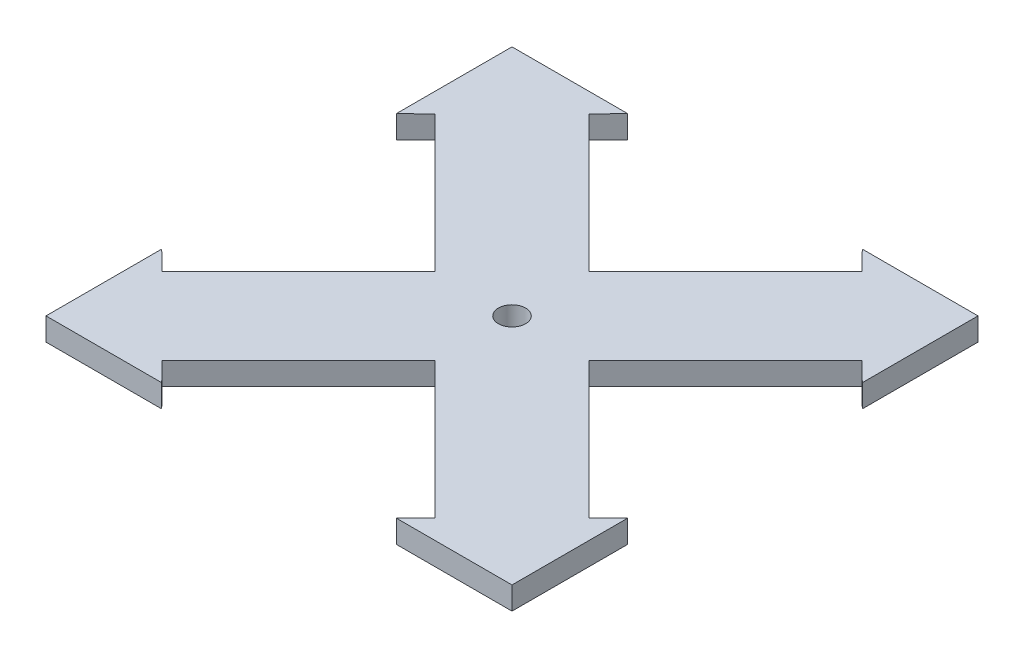
ISO-10303-21;
HEADER;
FILE_DESCRIPTION(('STEP AP214'),'2;1');
FILE_NAME('part.step','',(''),(''),'','','');
FILE_SCHEMA(('AUTOMOTIVE_DESIGN { 1 0 10303 214 1 1 1 1 }'));
ENDSEC;
DATA;
#1=APPLICATION_CONTEXT('core data for automotive mechanical design processes');
#2=APPLICATION_PROTOCOL_DEFINITION('international standard','automotive_design',2000,#1);
#3=PRODUCT_CONTEXT('',#1,'mechanical');
#4=PRODUCT('Part','Part','',(#3));
#5=PRODUCT_RELATED_PRODUCT_CATEGORY('part','',(#4));
#6=PRODUCT_DEFINITION_FORMATION('','',#4);
#7=PRODUCT_DEFINITION_CONTEXT('part definition',#1,'design');
#8=PRODUCT_DEFINITION('design','',#6,#7);
#9=PRODUCT_DEFINITION_SHAPE('','',#8);
#10=(LENGTH_UNIT() NAMED_UNIT(*) SI_UNIT(.MILLI.,.METRE.));
#11=(NAMED_UNIT(*) PLANE_ANGLE_UNIT() SI_UNIT($,.RADIAN.));
#12=(NAMED_UNIT(*) SI_UNIT($,.STERADIAN.) SOLID_ANGLE_UNIT());
#13=UNCERTAINTY_MEASURE_WITH_UNIT(LENGTH_MEASURE(1.E-05),#10,'distance_accuracy_value','');
#14=(GEOMETRIC_REPRESENTATION_CONTEXT(3) GLOBAL_UNCERTAINTY_ASSIGNED_CONTEXT((#13)) GLOBAL_UNIT_ASSIGNED_CONTEXT((#10,
#11,#12)) REPRESENTATION_CONTEXT('',''));
#15=CARTESIAN_POINT('',(0.,0.,0.));
#16=DIRECTION('',(0.,0.,1.));
#17=DIRECTION('',(1.,0.,0.));
#18=AXIS2_PLACEMENT_3D('',#15,#16,#17);
#19=CARTESIAN_POINT('',(0.,2.5,0.));
#20=DIRECTION('',(0.,-1.,0.));
#21=DIRECTION('',(0.,0.,-1.));
#22=AXIS2_PLACEMENT_3D('',#19,#20,#21);
#23=PLANE('',#22);
#24=DIRECTION('',(-0.707106781186783,0.,0.707106781186312));
#25=VECTOR('',#24,1.);
#26=CARTESIAN_POINT('',(-3.75314219151656E-12,2.5,-8.48528137424492));
#27=LINE('',#26,#25);
#28=CARTESIAN_POINT('',(15.,2.5,-23.4852813742387));
#29=VERTEX_POINT('',#28);
#30=CARTESIAN_POINT('',(-3.75314219151656E-12,2.5,-8.48528137424492));
#31=VERTEX_POINT('',#30);
#32=EDGE_CURVE('E273',#29,#31,#27,.T.);
#33=ORIENTED_EDGE('',*,*,#32,.T.);
#34=DIRECTION('',(-0.707106781186477,0.,-0.707106781186618));
#35=VECTOR('',#34,1.);
#36=CARTESIAN_POINT('',(-15.0000000000079,2.5,-23.485281374252));
#37=LINE('',#36,#35);
#38=CARTESIAN_POINT('',(-15.0000000000079,2.5,-23.485281374252));
#39=VERTEX_POINT('',#38);
#40=EDGE_CURVE('E141',#31,#39,#37,.T.);
#41=ORIENTED_EDGE('',*,*,#40,.T.);
#42=DIRECTION('',(0.699281678944915,0.,-0.714846230662218));
#43=VECTOR('',#42,1.);
#44=CARTESIAN_POINT('',(-15.0000000000079,2.5,-23.485281374252));
#45=LINE('',#44,#43);
#46=CARTESIAN_POINT('',(-12.9021549631807,2.5,-25.6298200662309));
#47=VERTEX_POINT('',#46);
#48=EDGE_CURVE('E336',#39,#47,#45,.T.);
#49=ORIENTED_EDGE('',*,*,#48,.T.);
#50=DIRECTION('',(-1.,0.,0.));
#51=VECTOR('',#50,1.);
#52=CARTESIAN_POINT('',(-25.6298200662306,2.5,-25.6298200662309));
#53=LINE('',#52,#51);
#54=CARTESIAN_POINT('',(-25.6298200662306,2.5,-25.6298200662309));
#55=VERTEX_POINT('',#54);
#56=EDGE_CURVE('E355',#47,#55,#53,.T.);
#57=ORIENTED_EDGE('',*,*,#56,.T.);
#58=DIRECTION('',(0.,0.,1.));
#59=VECTOR('',#58,1.);
#60=CARTESIAN_POINT('',(-25.6298200662306,2.5,-12.902154963181));
#61=LINE('',#60,#59);
#62=CARTESIAN_POINT('',(-25.6298200662306,2.5,-12.902154963181));
#63=VERTEX_POINT('',#62);
#64=EDGE_CURVE('E352',#55,#63,#61,.T.);
#65=ORIENTED_EDGE('',*,*,#64,.T.);
#66=DIRECTION('',(0.714846230665675,0.,-0.69928167894138));
#67=VECTOR('',#66,1.);
#68=CARTESIAN_POINT('',(-23.4852813742387,2.5,-15.0000000000002));
#69=LINE('',#68,#67);
#70=CARTESIAN_POINT('',(-23.4852813742387,2.5,-15.0000000000002));
#71=VERTEX_POINT('',#70);
#72=EDGE_CURVE('E354',#63,#71,#69,.T.);
#73=ORIENTED_EDGE('',*,*,#72,.T.);
#74=DIRECTION('',(0.707106781186644,0.,0.707106781186451));
#75=VECTOR('',#74,1.);
#76=CARTESIAN_POINT('',(-23.4852813742387,2.5,-15.0000000000002));
#77=LINE('',#76,#75);
#78=CARTESIAN_POINT('',(-8.48528137424864,2.5,-1.4210854715202E-11));
#79=VERTEX_POINT('',#78);
#80=EDGE_CURVE('E357',#71,#79,#77,.T.);
#81=ORIENTED_EDGE('',*,*,#80,.T.);
#82=DIRECTION('',(-0.707106781185841,0.,0.707106781187254));
#83=VECTOR('',#82,1.);
#84=CARTESIAN_POINT('',(-23.4852813742339,2.5,15.0000000000011));
#85=LINE('',#84,#83);
#86=CARTESIAN_POINT('',(-23.4852813742339,2.5,15.0000000000011));
#87=VERTEX_POINT('',#86);
#88=EDGE_CURVE('E363',#79,#87,#85,.T.);
#89=ORIENTED_EDGE('',*,*,#88,.T.);
#90=DIRECTION('',(-0.714846230666275,0.,-0.699281678940768));
#91=VECTOR('',#90,1.);
#92=CARTESIAN_POINT('',(-23.4852813742339,2.5,15.0000000000011));
#93=LINE('',#92,#91);
#94=CARTESIAN_POINT('',(-25.6298200662309,2.5,12.9021549631805));
#95=VERTEX_POINT('',#94);
#96=EDGE_CURVE('E365',#87,#95,#93,.T.);
#97=ORIENTED_EDGE('',*,*,#96,.T.);
#98=DIRECTION('',(0.,0.,1.));
#99=VECTOR('',#98,1.);
#100=CARTESIAN_POINT('',(-25.6298200662309,2.5,25.6298200662305));
#101=LINE('',#100,#99);
#102=CARTESIAN_POINT('',(-25.6298200662309,2.5,25.6298200662305));
#103=VERTEX_POINT('',#102);
#104=EDGE_CURVE('E367',#95,#103,#101,.T.);
#105=ORIENTED_EDGE('',*,*,#104,.T.);
#106=DIRECTION('',(1.,0.,0.));
#107=VECTOR('',#106,1.);
#108=CARTESIAN_POINT('',(-12.902154963181,2.5,25.6298200662305));
#109=LINE('',#108,#107);
#110=CARTESIAN_POINT('',(-12.902154963181,2.5,25.6298200662305));
#111=VERTEX_POINT('',#110);
#112=EDGE_CURVE('E369',#103,#111,#109,.T.);
#113=ORIENTED_EDGE('',*,*,#112,.T.);
#114=DIRECTION('',(-0.699281678883351,0.,-0.714846230722441));
#115=VECTOR('',#114,1.);
#116=CARTESIAN_POINT('',(-14.9999999999997,2.5,23.4852813738907));
#117=LINE('',#116,#115);
#118=CARTESIAN_POINT('',(-14.9999999999997,2.5,23.4852813738907));
#119=VERTEX_POINT('',#118);
#120=EDGE_CURVE('E371',#111,#119,#117,.T.);
#121=ORIENTED_EDGE('',*,*,#120,.T.);
#122=DIRECTION('',(0.707106781186939,0.,-0.707106781186156));
#123=VECTOR('',#122,1.);
#124=CARTESIAN_POINT('',(-14.9999999999997,2.5,23.4852813738907));
#125=LINE('',#124,#123);
#126=CARTESIAN_POINT('',(1.47254850175037E-11,2.5,8.48528137389289));
#127=VERTEX_POINT('',#126);
#128=EDGE_CURVE('E373',#119,#127,#125,.T.);
#129=ORIENTED_EDGE('',*,*,#128,.T.);
#130=DIRECTION('',(0.707106781187716,0.,0.707106781185379));
#131=VECTOR('',#130,1.);
#132=CARTESIAN_POINT('',(1.47254850175037E-11,2.5,8.48528137389289));
#133=LINE('',#132,#131);
#134=CARTESIAN_POINT('',(14.9999999999918,2.5,23.4852813738204));
#135=VERTEX_POINT('',#134);
#136=EDGE_CURVE('E375',#127,#135,#133,.T.);
#137=ORIENTED_EDGE('',*,*,#136,.T.);
#138=DIRECTION('',(-0.699281678870311,0.,0.714846230735197));
#139=VECTOR('',#138,1.);
#140=CARTESIAN_POINT('',(14.9999999999918,2.5,23.4852813738204));
#141=LINE('',#140,#139);
#142=CARTESIAN_POINT('',(12.9021549631805,2.5,25.6298200662307));
#143=VERTEX_POINT('',#142);
#144=EDGE_CURVE('E377',#135,#143,#141,.T.);
#145=ORIENTED_EDGE('',*,*,#144,.T.);
#146=DIRECTION('',(1.,0.,0.));
#147=VECTOR('',#146,1.);
#148=CARTESIAN_POINT('',(25.6298200662305,2.5,25.6298200662307));
#149=LINE('',#148,#147);
#150=CARTESIAN_POINT('',(25.6298200662305,2.5,25.6298200662307));
#151=VERTEX_POINT('',#150);
#152=EDGE_CURVE('E379',#143,#151,#149,.T.);
#153=ORIENTED_EDGE('',*,*,#152,.T.);
#154=DIRECTION('',(0.,0.,-1.));
#155=VECTOR('',#154,1.);
#156=CARTESIAN_POINT('',(25.6298200662304,2.5,12.9021549631808));
#157=LINE('',#156,#155);
#158=CARTESIAN_POINT('',(25.6298200662304,2.5,12.9021549631808));
#159=VERTEX_POINT('',#158);
#160=EDGE_CURVE('E381',#151,#159,#157,.T.);
#161=ORIENTED_EDGE('',*,*,#160,.T.);
#162=DIRECTION('',(-0.714846230665678,0.,0.699281678941378));
#163=VECTOR('',#162,1.);
#164=CARTESIAN_POINT('',(23.4852813742385,2.5,15.));
#165=LINE('',#164,#163);
#166=CARTESIAN_POINT('',(23.4852813742385,2.5,15.));
#167=VERTEX_POINT('',#166);
#168=EDGE_CURVE('E383',#159,#167,#165,.T.);
#169=ORIENTED_EDGE('',*,*,#168,.T.);
#170=DIRECTION('',(-0.707106781184294,0.,-0.707106781188801));
#171=VECTOR('',#170,1.);
#172=CARTESIAN_POINT('',(8.48528137434823,2.5,1.41048197427329E-11));
#173=LINE('',#172,#171);
#174=CARTESIAN_POINT('',(8.48528137434823,2.5,1.41048197427329E-11));
#175=VERTEX_POINT('',#174);
#176=EDGE_CURVE('E385',#167,#175,#173,.T.);
#177=ORIENTED_EDGE('',*,*,#176,.T.);
#178=DIRECTION('',(0.707106781182032,0.,-0.707106781191063));
#179=VECTOR('',#178,1.);
#180=CARTESIAN_POINT('',(8.48528137434823,2.5,1.41048197427329E-11));
#181=LINE('',#180,#179);
#182=CARTESIAN_POINT('',(23.4852813741639,2.5,-14.9999999999932));
#183=VERTEX_POINT('',#182);
#184=EDGE_CURVE('E387',#175,#183,#181,.T.);
#185=ORIENTED_EDGE('',*,*,#184,.T.);
#186=DIRECTION('',(0.714846230678996,0.,0.699281678927764));
#187=VECTOR('',#186,1.);
#188=CARTESIAN_POINT('',(23.4852813741639,2.5,-14.9999999999932));
#189=LINE('',#188,#187);
#190=CARTESIAN_POINT('',(25.6298200662307,2.5,-12.9021549631807));
#191=VERTEX_POINT('',#190);
#192=EDGE_CURVE('E208',#183,#191,#189,.T.);
#193=ORIENTED_EDGE('',*,*,#192,.T.);
#194=DIRECTION('',(0.,0.,-1.));
#195=VECTOR('',#194,1.);
#196=CARTESIAN_POINT('',(25.6298200662307,2.5,-25.6298200662306));
#197=LINE('',#196,#195);
#198=CARTESIAN_POINT('',(25.6298200662307,2.5,-25.6298200662306));
#199=VERTEX_POINT('',#198);
#200=EDGE_CURVE('E202',#191,#199,#197,.T.);
#201=ORIENTED_EDGE('',*,*,#200,.T.);
#202=DIRECTION('',(-1.,0.,0.));
#203=VECTOR('',#202,1.);
#204=CARTESIAN_POINT('',(12.9021549631808,2.5,-25.6298200662306));
#205=LINE('',#204,#203);
#206=CARTESIAN_POINT('',(12.9021549631808,2.5,-25.6298200662306));
#207=VERTEX_POINT('',#206);
#208=EDGE_CURVE('E206',#199,#207,#205,.T.);
#209=ORIENTED_EDGE('',*,*,#208,.T.);
#210=DIRECTION('',(0.699281678941379,0.,0.714846230665677));
#211=VECTOR('',#210,1.);
#212=CARTESIAN_POINT('',(15.,2.5,-23.4852813742387));
#213=LINE('',#212,#211);
#214=EDGE_CURVE('E50',#207,#29,#213,.T.);
#215=ORIENTED_EDGE('',*,*,#214,.T.);
#216=EDGE_LOOP('',(#33,#41,#49,#57,#65,#73,#81,#89,#97,#105,#113,#121,#129,#137,#145,#153,#161,
#169,#177,#185,#193,#201,#209,#215));
#217=FACE_BOUND('',#216,.T.);
#218=CARTESIAN_POINT('',(0.,2.5,0.));
#219=DIRECTION('',(0.,1.,0.));
#220=DIRECTION('',(0.,0.,1.));
#221=AXIS2_PLACEMENT_3D('',#218,#219,#220);
#222=CIRCLE('',#221,1.5);
#223=CARTESIAN_POINT('',(0.,2.5,1.5));
#224=VERTEX_POINT('',#223);
#225=EDGE_CURVE('E230',#224,#224,#222,.T.);
#226=ORIENTED_EDGE('',*,*,#225,.F.);
#227=EDGE_LOOP('',(#226));
#228=FACE_BOUND('',#227,.T.);
#229=ADVANCED_FACE('F33',(#217,#228),#23,.F.);
#230=CARTESIAN_POINT('',(0.,0.,0.));
#231=DIRECTION('',(0.,-1.,0.));
#232=DIRECTION('',(0.,0.,-1.));
#233=AXIS2_PLACEMENT_3D('',#230,#231,#232);
#234=PLANE('',#233);
#235=DIRECTION('',(-0.707106781186783,0.,0.707106781186312));
#236=VECTOR('',#235,1.);
#237=CARTESIAN_POINT('',(-3.75314219151656E-12,0.,-8.48528137424492));
#238=LINE('',#237,#236);
#239=CARTESIAN_POINT('',(15.,0.,-23.4852813742387));
#240=VERTEX_POINT('',#239);
#241=CARTESIAN_POINT('',(-3.75314219151656E-12,0.,-8.48528137424492));
#242=VERTEX_POINT('',#241);
#243=EDGE_CURVE('E226',#240,#242,#238,.T.);
#244=ORIENTED_EDGE('',*,*,#243,.F.);
#245=DIRECTION('',(0.699281678941379,0.,0.714846230665677));
#246=VECTOR('',#245,1.);
#247=CARTESIAN_POINT('',(15.,0.,-23.4852813742387));
#248=LINE('',#247,#246);
#249=CARTESIAN_POINT('',(12.9021549631808,0.,-25.6298200662306));
#250=VERTEX_POINT('',#249);
#251=EDGE_CURVE('E133',#250,#240,#248,.T.);
#252=ORIENTED_EDGE('',*,*,#251,.F.);
#253=DIRECTION('',(-1.,0.,0.));
#254=VECTOR('',#253,1.);
#255=CARTESIAN_POINT('',(12.9021549631808,0.,-25.6298200662306));
#256=LINE('',#255,#254);
#257=CARTESIAN_POINT('',(25.6298200662307,0.,-25.6298200662306));
#258=VERTEX_POINT('',#257);
#259=EDGE_CURVE('E127',#258,#250,#256,.T.);
#260=ORIENTED_EDGE('',*,*,#259,.F.);
#261=DIRECTION('',(0.,0.,-1.));
#262=VECTOR('',#261,1.);
#263=CARTESIAN_POINT('',(25.6298200662307,0.,-25.6298200662306));
#264=LINE('',#263,#262);
#265=CARTESIAN_POINT('',(25.6298200662307,0.,-12.9021549631807));
#266=VERTEX_POINT('',#265);
#267=EDGE_CURVE('E216',#266,#258,#264,.T.);
#268=ORIENTED_EDGE('',*,*,#267,.F.);
#269=DIRECTION('',(0.714846230678996,0.,0.699281678927764));
#270=VECTOR('',#269,1.);
#271=CARTESIAN_POINT('',(23.4852813741639,0.,-14.9999999999932));
#272=LINE('',#271,#270);
#273=CARTESIAN_POINT('',(23.4852813741639,0.,-14.9999999999932));
#274=VERTEX_POINT('',#273);
#275=EDGE_CURVE('E268',#274,#266,#272,.T.);
#276=ORIENTED_EDGE('',*,*,#275,.F.);
#277=DIRECTION('',(0.707106781182032,0.,-0.707106781191063));
#278=VECTOR('',#277,1.);
#279=CARTESIAN_POINT('',(8.48528137434823,0.,1.41048197427329E-11));
#280=LINE('',#279,#278);
#281=CARTESIAN_POINT('',(8.48528137434823,0.,1.41048197427329E-11));
#282=VERTEX_POINT('',#281);
#283=EDGE_CURVE('E266',#282,#274,#280,.T.);
#284=ORIENTED_EDGE('',*,*,#283,.F.);
#285=DIRECTION('',(-0.707106781184294,0.,-0.707106781188801));
#286=VECTOR('',#285,1.);
#287=CARTESIAN_POINT('',(8.48528137434823,0.,1.41048197427329E-11));
#288=LINE('',#287,#286);
#289=CARTESIAN_POINT('',(23.4852813742385,0.,15.));
#290=VERTEX_POINT('',#289);
#291=EDGE_CURVE('E264',#290,#282,#288,.T.);
#292=ORIENTED_EDGE('',*,*,#291,.F.);
#293=DIRECTION('',(-0.714846230665678,0.,0.699281678941378));
#294=VECTOR('',#293,1.);
#295=CARTESIAN_POINT('',(23.4852813742385,0.,15.));
#296=LINE('',#295,#294);
#297=CARTESIAN_POINT('',(25.6298200662304,0.,12.9021549631808));
#298=VERTEX_POINT('',#297);
#299=EDGE_CURVE('E262',#298,#290,#296,.T.);
#300=ORIENTED_EDGE('',*,*,#299,.F.);
#301=DIRECTION('',(0.,0.,-1.));
#302=VECTOR('',#301,1.);
#303=CARTESIAN_POINT('',(25.6298200662304,0.,12.9021549631808));
#304=LINE('',#303,#302);
#305=CARTESIAN_POINT('',(25.6298200662305,0.,25.6298200662307));
#306=VERTEX_POINT('',#305);
#307=EDGE_CURVE('E260',#306,#298,#304,.T.);
#308=ORIENTED_EDGE('',*,*,#307,.F.);
#309=DIRECTION('',(1.,0.,0.));
#310=VECTOR('',#309,1.);
#311=CARTESIAN_POINT('',(25.6298200662305,0.,25.6298200662307));
#312=LINE('',#311,#310);
#313=CARTESIAN_POINT('',(12.9021549631805,0.,25.6298200662307));
#314=VERTEX_POINT('',#313);
#315=EDGE_CURVE('E258',#314,#306,#312,.T.);
#316=ORIENTED_EDGE('',*,*,#315,.F.);
#317=DIRECTION('',(-0.699281678870311,0.,0.714846230735197));
#318=VECTOR('',#317,1.);
#319=CARTESIAN_POINT('',(14.9999999999918,0.,23.4852813738204));
#320=LINE('',#319,#318);
#321=CARTESIAN_POINT('',(14.9999999999918,0.,23.4852813738204));
#322=VERTEX_POINT('',#321);
#323=EDGE_CURVE('E256',#322,#314,#320,.T.);
#324=ORIENTED_EDGE('',*,*,#323,.F.);
#325=DIRECTION('',(0.707106781187716,0.,0.707106781185379));
#326=VECTOR('',#325,1.);
#327=CARTESIAN_POINT('',(1.47254850175037E-11,0.,8.48528137389289));
#328=LINE('',#327,#326);
#329=CARTESIAN_POINT('',(1.47254850175037E-11,0.,8.48528137389289));
#330=VERTEX_POINT('',#329);
#331=EDGE_CURVE('E254',#330,#322,#328,.T.);
#332=ORIENTED_EDGE('',*,*,#331,.F.);
#333=DIRECTION('',(0.707106781186939,0.,-0.707106781186156));
#334=VECTOR('',#333,1.);
#335=CARTESIAN_POINT('',(-14.9999999999997,0.,23.4852813738907));
#336=LINE('',#335,#334);
#337=CARTESIAN_POINT('',(-14.9999999999997,0.,23.4852813738907));
#338=VERTEX_POINT('',#337);
#339=EDGE_CURVE('E252',#338,#330,#336,.T.);
#340=ORIENTED_EDGE('',*,*,#339,.F.);
#341=DIRECTION('',(-0.699281678883351,0.,-0.714846230722441));
#342=VECTOR('',#341,1.);
#343=CARTESIAN_POINT('',(-14.9999999999997,0.,23.4852813738907));
#344=LINE('',#343,#342);
#345=CARTESIAN_POINT('',(-12.902154963181,0.,25.6298200662305));
#346=VERTEX_POINT('',#345);
#347=EDGE_CURVE('E250',#346,#338,#344,.T.);
#348=ORIENTED_EDGE('',*,*,#347,.F.);
#349=DIRECTION('',(1.,0.,0.));
#350=VECTOR('',#349,1.);
#351=CARTESIAN_POINT('',(-12.902154963181,0.,25.6298200662305));
#352=LINE('',#351,#350);
#353=CARTESIAN_POINT('',(-25.6298200662309,0.,25.6298200662305));
#354=VERTEX_POINT('',#353);
#355=EDGE_CURVE('E248',#354,#346,#352,.T.);
#356=ORIENTED_EDGE('',*,*,#355,.F.);
#357=DIRECTION('',(0.,0.,1.));
#358=VECTOR('',#357,1.);
#359=CARTESIAN_POINT('',(-25.6298200662309,0.,25.6298200662305));
#360=LINE('',#359,#358);
#361=CARTESIAN_POINT('',(-25.6298200662309,0.,12.9021549631805));
#362=VERTEX_POINT('',#361);
#363=EDGE_CURVE('E246',#362,#354,#360,.T.);
#364=ORIENTED_EDGE('',*,*,#363,.F.);
#365=DIRECTION('',(-0.714846230666275,0.,-0.699281678940768));
#366=VECTOR('',#365,1.);
#367=CARTESIAN_POINT('',(-23.4852813742339,0.,15.0000000000011));
#368=LINE('',#367,#366);
#369=CARTESIAN_POINT('',(-23.4852813742339,0.,15.0000000000011));
#370=VERTEX_POINT('',#369);
#371=EDGE_CURVE('E244',#370,#362,#368,.T.);
#372=ORIENTED_EDGE('',*,*,#371,.F.);
#373=DIRECTION('',(-0.707106781185841,0.,0.707106781187254));
#374=VECTOR('',#373,1.);
#375=CARTESIAN_POINT('',(-23.4852813742339,0.,15.0000000000011));
#376=LINE('',#375,#374);
#377=CARTESIAN_POINT('',(-8.48528137424864,0.,-1.4210854715202E-11));
#378=VERTEX_POINT('',#377);
#379=EDGE_CURVE('E242',#378,#370,#376,.T.);
#380=ORIENTED_EDGE('',*,*,#379,.F.);
#381=DIRECTION('',(0.707106781186644,0.,0.707106781186451));
#382=VECTOR('',#381,1.);
#383=CARTESIAN_POINT('',(-23.4852813742387,0.,-15.0000000000002));
#384=LINE('',#383,#382);
#385=CARTESIAN_POINT('',(-23.4852813742387,0.,-15.0000000000002));
#386=VERTEX_POINT('',#385);
#387=EDGE_CURVE('E240',#386,#378,#384,.T.);
#388=ORIENTED_EDGE('',*,*,#387,.F.);
#389=DIRECTION('',(0.714846230665675,0.,-0.69928167894138));
#390=VECTOR('',#389,1.);
#391=CARTESIAN_POINT('',(-23.4852813742387,0.,-15.0000000000002));
#392=LINE('',#391,#390);
#393=CARTESIAN_POINT('',(-25.6298200662306,0.,-12.902154963181));
#394=VERTEX_POINT('',#393);
#395=EDGE_CURVE('E238',#394,#386,#392,.T.);
#396=ORIENTED_EDGE('',*,*,#395,.F.);
#397=DIRECTION('',(0.,0.,1.));
#398=VECTOR('',#397,1.);
#399=CARTESIAN_POINT('',(-25.6298200662306,0.,-12.902154963181));
#400=LINE('',#399,#398);
#401=CARTESIAN_POINT('',(-25.6298200662306,0.,-25.6298200662309));
#402=VERTEX_POINT('',#401);
#403=EDGE_CURVE('E236',#402,#394,#400,.T.);
#404=ORIENTED_EDGE('',*,*,#403,.F.);
#405=DIRECTION('',(-1.,0.,0.));
#406=VECTOR('',#405,1.);
#407=CARTESIAN_POINT('',(-25.6298200662306,0.,-25.6298200662309));
#408=LINE('',#407,#406);
#409=CARTESIAN_POINT('',(-12.9021549631807,0.,-25.6298200662309));
#410=VERTEX_POINT('',#409);
#411=EDGE_CURVE('E234',#410,#402,#408,.T.);
#412=ORIENTED_EDGE('',*,*,#411,.F.);
#413=DIRECTION('',(0.699281678944915,0.,-0.714846230662218));
#414=VECTOR('',#413,1.);
#415=CARTESIAN_POINT('',(-15.0000000000079,0.,-23.485281374252));
#416=LINE('',#415,#414);
#417=CARTESIAN_POINT('',(-15.0000000000079,0.,-23.485281374252));
#418=VERTEX_POINT('',#417);
#419=EDGE_CURVE('E232',#418,#410,#416,.T.);
#420=ORIENTED_EDGE('',*,*,#419,.F.);
#421=DIRECTION('',(-0.707106781186477,0.,-0.707106781186618));
#422=VECTOR('',#421,1.);
#423=CARTESIAN_POINT('',(-15.0000000000079,0.,-23.485281374252));
#424=LINE('',#423,#422);
#425=EDGE_CURVE('E229',#242,#418,#424,.T.);
#426=ORIENTED_EDGE('',*,*,#425,.F.);
#427=EDGE_LOOP('',(#244,#252,#260,#268,#276,#284,#292,#300,#308,#316,#324,#332,#340,#348,#356,
#364,#372,#380,#388,#396,#404,#412,#420,#426));
#428=FACE_BOUND('',#427,.T.);
#429=CARTESIAN_POINT('',(0.,0.,0.));
#430=DIRECTION('',(0.,1.,0.));
#431=DIRECTION('',(0.,0.,1.));
#432=AXIS2_PLACEMENT_3D('',#429,#430,#431);
#433=CIRCLE('',#432,1.5);
#434=CARTESIAN_POINT('',(0.,0.,1.5));
#435=VERTEX_POINT('',#434);
#436=EDGE_CURVE('E690',#435,#435,#433,.T.);
#437=ORIENTED_EDGE('',*,*,#436,.T.);
#438=EDGE_LOOP('',(#437));
#439=FACE_BOUND('',#438,.T.);
#440=ADVANCED_FACE('F340',(#428,#439),#234,.T.);
#441=CARTESIAN_POINT('',(-3.75314219151656E-12,2.5,-8.48528137424492));
#442=DIRECTION('',(0.707106781186312,0.,0.707106781186783));
#443=DIRECTION('',(0.707106781186783,0.,-0.707106781186312));
#444=AXIS2_PLACEMENT_3D('',#441,#442,#443);
#445=PLANE('',#444);
#446=ORIENTED_EDGE('',*,*,#243,.T.);
#447=DIRECTION('',(0.,-1.,0.));
#448=VECTOR('',#447,1.);
#449=CARTESIAN_POINT('',(-3.75314219151656E-12,2.5,-8.48528137424492));
#450=LINE('',#449,#448);
#451=EDGE_CURVE('E11',#31,#242,#450,.T.);
#452=ORIENTED_EDGE('',*,*,#451,.F.);
#453=ORIENTED_EDGE('',*,*,#32,.F.);
#454=DIRECTION('',(0.,-1.,0.));
#455=VECTOR('',#454,1.);
#456=CARTESIAN_POINT('',(15.,2.5,-23.4852813742387));
#457=LINE('',#456,#455);
#458=EDGE_CURVE('E222',#29,#240,#457,.T.);
#459=ORIENTED_EDGE('',*,*,#458,.T.);
#460=EDGE_LOOP('',(#446,#452,#453,#459));
#461=FACE_BOUND('',#460,.T.);
#462=ADVANCED_FACE('F35',(#461),#445,.F.);
#463=CARTESIAN_POINT('',(-15.0000000000079,2.5,-23.485281374252));
#464=DIRECTION('',(-0.707106781186618,0.,0.707106781186477));
#465=DIRECTION('',(0.707106781186477,0.,0.707106781186618));
#466=AXIS2_PLACEMENT_3D('',#463,#464,#465);
#467=PLANE('',#466);
#468=ORIENTED_EDGE('',*,*,#425,.T.);
#469=DIRECTION('',(0.,-1.,0.));
#470=VECTOR('',#469,1.);
#471=CARTESIAN_POINT('',(-15.0000000000079,2.5,-23.485281374252));
#472=LINE('',#471,#470);
#473=EDGE_CURVE('E42',#39,#418,#472,.T.);
#474=ORIENTED_EDGE('',*,*,#473,.F.);
#475=ORIENTED_EDGE('',*,*,#40,.F.);
#476=ORIENTED_EDGE('',*,*,#451,.T.);
#477=EDGE_LOOP('',(#468,#474,#475,#476));
#478=FACE_BOUND('',#477,.T.);
#479=ADVANCED_FACE('F421',(#478),#467,.F.);
#480=CARTESIAN_POINT('',(-15.0000000000079,2.5,-23.485281374252));
#481=DIRECTION('',(-0.714846230662218,0.,-0.699281678944915));
#482=DIRECTION('',(-0.699281678944915,0.,0.714846230662218));
#483=AXIS2_PLACEMENT_3D('',#480,#481,#482);
#484=PLANE('',#483);
#485=ORIENTED_EDGE('',*,*,#419,.T.);
#486=DIRECTION('',(0.,-1.,0.));
#487=VECTOR('',#486,1.);
#488=CARTESIAN_POINT('',(-12.9021549631807,2.5,-25.6298200662309));
#489=LINE('',#488,#487);
#490=EDGE_CURVE('E328',#47,#410,#489,.T.);
#491=ORIENTED_EDGE('',*,*,#490,.F.);
#492=ORIENTED_EDGE('',*,*,#48,.F.);
#493=ORIENTED_EDGE('',*,*,#473,.T.);
#494=EDGE_LOOP('',(#485,#491,#492,#493));
#495=FACE_BOUND('',#494,.T.);
#496=ADVANCED_FACE('F334',(#495),#484,.F.);
#497=CARTESIAN_POINT('',(-25.6298200662306,2.5,-25.6298200662309));
#498=DIRECTION('',(0.,0.,1.));
#499=DIRECTION('',(1.,0.,0.));
#500=AXIS2_PLACEMENT_3D('',#497,#498,#499);
#501=PLANE('',#500);
#502=ORIENTED_EDGE('',*,*,#411,.T.);
#503=DIRECTION('',(0.,-1.,0.));
#504=VECTOR('',#503,1.);
#505=CARTESIAN_POINT('',(-25.6298200662306,2.5,-25.6298200662309));
#506=LINE('',#505,#504);
#507=EDGE_CURVE('E325',#55,#402,#506,.T.);
#508=ORIENTED_EDGE('',*,*,#507,.F.);
#509=ORIENTED_EDGE('',*,*,#56,.F.);
#510=ORIENTED_EDGE('',*,*,#490,.T.);
#511=EDGE_LOOP('',(#502,#508,#509,#510));
#512=FACE_BOUND('',#511,.T.);
#513=ADVANCED_FACE('F346',(#512),#501,.F.);
#514=CARTESIAN_POINT('',(-25.6298200662306,2.5,-12.902154963181));
#515=DIRECTION('',(1.,0.,0.));
#516=DIRECTION('',(0.,0.,-1.));
#517=AXIS2_PLACEMENT_3D('',#514,#515,#516);
#518=PLANE('',#517);
#519=ORIENTED_EDGE('',*,*,#403,.T.);
#520=DIRECTION('',(0.,-1.,0.));
#521=VECTOR('',#520,1.);
#522=CARTESIAN_POINT('',(-25.6298200662306,2.5,-12.902154963181));
#523=LINE('',#522,#521);
#524=EDGE_CURVE('E322',#63,#394,#523,.T.);
#525=ORIENTED_EDGE('',*,*,#524,.F.);
#526=ORIENTED_EDGE('',*,*,#64,.F.);
#527=ORIENTED_EDGE('',*,*,#507,.T.);
#528=EDGE_LOOP('',(#519,#525,#526,#527));
#529=FACE_BOUND('',#528,.T.);
#530=ADVANCED_FACE('F350',(#529),#518,.F.);
#531=CARTESIAN_POINT('',(-23.4852813742387,2.5,-15.0000000000002));
#532=DIRECTION('',(-0.69928167894138,0.,-0.714846230665675));
#533=DIRECTION('',(-0.714846230665675,0.,0.69928167894138));
#534=AXIS2_PLACEMENT_3D('',#531,#532,#533);
#535=PLANE('',#534);
#536=ORIENTED_EDGE('',*,*,#395,.T.);
#537=DIRECTION('',(0.,-1.,0.));
#538=VECTOR('',#537,1.);
#539=CARTESIAN_POINT('',(-23.4852813742387,2.5,-15.0000000000002));
#540=LINE('',#539,#538);
#541=EDGE_CURVE('E319',#71,#386,#540,.T.);
#542=ORIENTED_EDGE('',*,*,#541,.F.);
#543=ORIENTED_EDGE('',*,*,#72,.F.);
#544=ORIENTED_EDGE('',*,*,#524,.T.);
#545=EDGE_LOOP('',(#536,#542,#543,#544));
#546=FACE_BOUND('',#545,.T.);
#547=ADVANCED_FACE('F434',(#546),#535,.F.);
#548=CARTESIAN_POINT('',(-23.4852813742387,2.5,-15.0000000000002));
#549=DIRECTION('',(0.707106781186451,0.,-0.707106781186644));
#550=DIRECTION('',(-0.707106781186644,0.,-0.707106781186451));
#551=AXIS2_PLACEMENT_3D('',#548,#549,#550);
#552=PLANE('',#551);
#553=ORIENTED_EDGE('',*,*,#387,.T.);
#554=DIRECTION('',(0.,-1.,0.));
#555=VECTOR('',#554,1.);
#556=CARTESIAN_POINT('',(-8.48528137424864,2.5,-1.4210854715202E-11));
#557=LINE('',#556,#555);
#558=EDGE_CURVE('E316',#79,#378,#557,.T.);
#559=ORIENTED_EDGE('',*,*,#558,.F.);
#560=ORIENTED_EDGE('',*,*,#80,.F.);
#561=ORIENTED_EDGE('',*,*,#541,.T.);
#562=EDGE_LOOP('',(#553,#559,#560,#561));
#563=FACE_BOUND('',#562,.T.);
#564=ADVANCED_FACE('F437',(#563),#552,.F.);
#565=CARTESIAN_POINT('',(-23.4852813742339,2.5,15.0000000000011));
#566=DIRECTION('',(0.707106781187254,0.,0.707106781185841));
#567=DIRECTION('',(0.707106781185841,0.,-0.707106781187254));
#568=AXIS2_PLACEMENT_3D('',#565,#566,#567);
#569=PLANE('',#568);
#570=ORIENTED_EDGE('',*,*,#379,.T.);
#571=DIRECTION('',(0.,-1.,0.));
#572=VECTOR('',#571,1.);
#573=CARTESIAN_POINT('',(-23.4852813742339,2.5,15.0000000000011));
#574=LINE('',#573,#572);
#575=EDGE_CURVE('E313',#87,#370,#574,.T.);
#576=ORIENTED_EDGE('',*,*,#575,.F.);
#577=ORIENTED_EDGE('',*,*,#88,.F.);
#578=ORIENTED_EDGE('',*,*,#558,.T.);
#579=EDGE_LOOP('',(#570,#576,#577,#578));
#580=FACE_BOUND('',#579,.T.);
#581=ADVANCED_FACE('F441',(#580),#569,.F.);
#582=CARTESIAN_POINT('',(-23.4852813742339,2.5,15.0000000000011));
#583=DIRECTION('',(-0.699281678940768,0.,0.714846230666275));
#584=DIRECTION('',(0.714846230666275,0.,0.699281678940768));
#585=AXIS2_PLACEMENT_3D('',#582,#583,#584);
#586=PLANE('',#585);
#587=ORIENTED_EDGE('',*,*,#371,.T.);
#588=DIRECTION('',(0.,-1.,0.));
#589=VECTOR('',#588,1.);
#590=CARTESIAN_POINT('',(-25.6298200662309,2.5,12.9021549631805));
#591=LINE('',#590,#589);
#592=EDGE_CURVE('E310',#95,#362,#591,.T.);
#593=ORIENTED_EDGE('',*,*,#592,.F.);
#594=ORIENTED_EDGE('',*,*,#96,.F.);
#595=ORIENTED_EDGE('',*,*,#575,.T.);
#596=EDGE_LOOP('',(#587,#593,#594,#595));
#597=FACE_BOUND('',#596,.T.);
#598=ADVANCED_FACE('F445',(#597),#586,.F.);
#599=CARTESIAN_POINT('',(-25.6298200662309,2.5,25.6298200662305));
#600=DIRECTION('',(1.,0.,0.));
#601=DIRECTION('',(0.,0.,-1.));
#602=AXIS2_PLACEMENT_3D('',#599,#600,#601);
#603=PLANE('',#602);
#604=ORIENTED_EDGE('',*,*,#363,.T.);
#605=DIRECTION('',(0.,-1.,0.));
#606=VECTOR('',#605,1.);
#607=CARTESIAN_POINT('',(-25.6298200662309,2.5,25.6298200662305));
#608=LINE('',#607,#606);
#609=EDGE_CURVE('E307',#103,#354,#608,.T.);
#610=ORIENTED_EDGE('',*,*,#609,.F.);
#611=ORIENTED_EDGE('',*,*,#104,.F.);
#612=ORIENTED_EDGE('',*,*,#592,.T.);
#613=EDGE_LOOP('',(#604,#610,#611,#612));
#614=FACE_BOUND('',#613,.T.);
#615=ADVANCED_FACE('F449',(#614),#603,.F.);
#616=CARTESIAN_POINT('',(-12.902154963181,2.5,25.6298200662305));
#617=DIRECTION('',(0.,0.,-1.));
#618=DIRECTION('',(-1.,0.,0.));
#619=AXIS2_PLACEMENT_3D('',#616,#617,#618);
#620=PLANE('',#619);
#621=ORIENTED_EDGE('',*,*,#355,.T.);
#622=DIRECTION('',(0.,-1.,0.));
#623=VECTOR('',#622,1.);
#624=CARTESIAN_POINT('',(-12.902154963181,2.5,25.6298200662305));
#625=LINE('',#624,#623);
#626=EDGE_CURVE('E304',#111,#346,#625,.T.);
#627=ORIENTED_EDGE('',*,*,#626,.F.);
#628=ORIENTED_EDGE('',*,*,#112,.F.);
#629=ORIENTED_EDGE('',*,*,#609,.T.);
#630=EDGE_LOOP('',(#621,#627,#628,#629));
#631=FACE_BOUND('',#630,.T.);
#632=ADVANCED_FACE('F453',(#631),#620,.F.);
#633=CARTESIAN_POINT('',(-14.9999999999997,2.5,23.4852813738907));
#634=DIRECTION('',(-0.714846230722441,0.,0.699281678883351));
#635=DIRECTION('',(0.699281678883351,0.,0.714846230722441));
#636=AXIS2_PLACEMENT_3D('',#633,#634,#635);
#637=PLANE('',#636);
#638=ORIENTED_EDGE('',*,*,#347,.T.);
#639=DIRECTION('',(0.,-1.,0.));
#640=VECTOR('',#639,1.);
#641=CARTESIAN_POINT('',(-14.9999999999997,2.5,23.4852813738907));
#642=LINE('',#641,#640);
#643=EDGE_CURVE('E301',#119,#338,#642,.T.);
#644=ORIENTED_EDGE('',*,*,#643,.F.);
#645=ORIENTED_EDGE('',*,*,#120,.F.);
#646=ORIENTED_EDGE('',*,*,#626,.T.);
#647=EDGE_LOOP('',(#638,#644,#645,#646));
#648=FACE_BOUND('',#647,.T.);
#649=ADVANCED_FACE('F457',(#648),#637,.F.);
#650=CARTESIAN_POINT('',(-14.9999999999997,2.5,23.4852813738907));
#651=DIRECTION('',(-0.707106781186156,0.,-0.707106781186939));
#652=DIRECTION('',(-0.707106781186939,0.,0.707106781186156));
#653=AXIS2_PLACEMENT_3D('',#650,#651,#652);
#654=PLANE('',#653);
#655=ORIENTED_EDGE('',*,*,#339,.T.);
#656=DIRECTION('',(0.,-1.,0.));
#657=VECTOR('',#656,1.);
#658=CARTESIAN_POINT('',(1.47254850175037E-11,2.5,8.48528137389289));
#659=LINE('',#658,#657);
#660=EDGE_CURVE('E298',#127,#330,#659,.T.);
#661=ORIENTED_EDGE('',*,*,#660,.F.);
#662=ORIENTED_EDGE('',*,*,#128,.F.);
#663=ORIENTED_EDGE('',*,*,#643,.T.);
#664=EDGE_LOOP('',(#655,#661,#662,#663));
#665=FACE_BOUND('',#664,.T.);
#666=ADVANCED_FACE('F461',(#665),#654,.F.);
#667=CARTESIAN_POINT('',(1.47254850175037E-11,2.5,8.48528137389289));
#668=DIRECTION('',(0.707106781185379,0.,-0.707106781187716));
#669=DIRECTION('',(-0.707106781187716,0.,-0.707106781185379));
#670=AXIS2_PLACEMENT_3D('',#667,#668,#669);
#671=PLANE('',#670);
#672=ORIENTED_EDGE('',*,*,#331,.T.);
#673=DIRECTION('',(0.,-1.,0.));
#674=VECTOR('',#673,1.);
#675=CARTESIAN_POINT('',(14.9999999999918,2.5,23.4852813738204));
#676=LINE('',#675,#674);
#677=EDGE_CURVE('E295',#135,#322,#676,.T.);
#678=ORIENTED_EDGE('',*,*,#677,.F.);
#679=ORIENTED_EDGE('',*,*,#136,.F.);
#680=ORIENTED_EDGE('',*,*,#660,.T.);
#681=EDGE_LOOP('',(#672,#678,#679,#680));
#682=FACE_BOUND('',#681,.T.);
#683=ADVANCED_FACE('F465',(#682),#671,.F.);
#684=CARTESIAN_POINT('',(14.9999999999918,2.5,23.4852813738204));
#685=DIRECTION('',(0.714846230735197,0.,0.699281678870311));
#686=DIRECTION('',(0.699281678870311,0.,-0.714846230735197));
#687=AXIS2_PLACEMENT_3D('',#684,#685,#686);
#688=PLANE('',#687);
#689=ORIENTED_EDGE('',*,*,#323,.T.);
#690=DIRECTION('',(0.,-1.,0.));
#691=VECTOR('',#690,1.);
#692=CARTESIAN_POINT('',(12.9021549631805,2.5,25.6298200662307));
#693=LINE('',#692,#691);
#694=EDGE_CURVE('E292',#143,#314,#693,.T.);
#695=ORIENTED_EDGE('',*,*,#694,.F.);
#696=ORIENTED_EDGE('',*,*,#144,.F.);
#697=ORIENTED_EDGE('',*,*,#677,.T.);
#698=EDGE_LOOP('',(#689,#695,#696,#697));
#699=FACE_BOUND('',#698,.T.);
#700=ADVANCED_FACE('F469',(#699),#688,.F.);
#701=CARTESIAN_POINT('',(25.6298200662305,2.5,25.6298200662307));
#702=DIRECTION('',(0.,0.,-1.));
#703=DIRECTION('',(-1.,0.,0.));
#704=AXIS2_PLACEMENT_3D('',#701,#702,#703);
#705=PLANE('',#704);
#706=ORIENTED_EDGE('',*,*,#315,.T.);
#707=DIRECTION('',(0.,-1.,0.));
#708=VECTOR('',#707,1.);
#709=CARTESIAN_POINT('',(25.6298200662305,2.5,25.6298200662307));
#710=LINE('',#709,#708);
#711=EDGE_CURVE('E289',#151,#306,#710,.T.);
#712=ORIENTED_EDGE('',*,*,#711,.F.);
#713=ORIENTED_EDGE('',*,*,#152,.F.);
#714=ORIENTED_EDGE('',*,*,#694,.T.);
#715=EDGE_LOOP('',(#706,#712,#713,#714));
#716=FACE_BOUND('',#715,.T.);
#717=ADVANCED_FACE('F473',(#716),#705,.F.);
#718=CARTESIAN_POINT('',(25.6298200662304,2.5,12.9021549631808));
#719=DIRECTION('',(-1.,0.,0.));
#720=DIRECTION('',(0.,0.,1.));
#721=AXIS2_PLACEMENT_3D('',#718,#719,#720);
#722=PLANE('',#721);
#723=ORIENTED_EDGE('',*,*,#307,.T.);
#724=DIRECTION('',(0.,-1.,0.));
#725=VECTOR('',#724,1.);
#726=CARTESIAN_POINT('',(25.6298200662304,2.5,12.9021549631808));
#727=LINE('',#726,#725);
#728=EDGE_CURVE('E286',#159,#298,#727,.T.);
#729=ORIENTED_EDGE('',*,*,#728,.F.);
#730=ORIENTED_EDGE('',*,*,#160,.F.);
#731=ORIENTED_EDGE('',*,*,#711,.T.);
#732=EDGE_LOOP('',(#723,#729,#730,#731));
#733=FACE_BOUND('',#732,.T.);
#734=ADVANCED_FACE('F477',(#733),#722,.F.);
#735=CARTESIAN_POINT('',(23.4852813742385,2.5,15.));
#736=DIRECTION('',(0.699281678941378,0.,0.714846230665678));
#737=DIRECTION('',(0.714846230665678,0.,-0.699281678941378));
#738=AXIS2_PLACEMENT_3D('',#735,#736,#737);
#739=PLANE('',#738);
#740=ORIENTED_EDGE('',*,*,#299,.T.);
#741=DIRECTION('',(0.,-1.,0.));
#742=VECTOR('',#741,1.);
#743=CARTESIAN_POINT('',(23.4852813742385,2.5,15.));
#744=LINE('',#743,#742);
#745=EDGE_CURVE('E283',#167,#290,#744,.T.);
#746=ORIENTED_EDGE('',*,*,#745,.F.);
#747=ORIENTED_EDGE('',*,*,#168,.F.);
#748=ORIENTED_EDGE('',*,*,#728,.T.);
#749=EDGE_LOOP('',(#740,#746,#747,#748));
#750=FACE_BOUND('',#749,.T.);
#751=ADVANCED_FACE('F481',(#750),#739,.F.);
#752=CARTESIAN_POINT('',(8.48528137434823,2.5,1.41048197427329E-11));
#753=DIRECTION('',(-0.707106781188801,0.,0.707106781184294));
#754=DIRECTION('',(0.707106781184294,0.,0.707106781188801));
#755=AXIS2_PLACEMENT_3D('',#752,#753,#754);
#756=PLANE('',#755);
#757=ORIENTED_EDGE('',*,*,#291,.T.);
#758=DIRECTION('',(0.,-1.,0.));
#759=VECTOR('',#758,1.);
#760=CARTESIAN_POINT('',(8.48528137434823,2.5,1.41048197427329E-11));
#761=LINE('',#760,#759);
#762=EDGE_CURVE('E280',#175,#282,#761,.T.);
#763=ORIENTED_EDGE('',*,*,#762,.F.);
#764=ORIENTED_EDGE('',*,*,#176,.F.);
#765=ORIENTED_EDGE('',*,*,#745,.T.);
#766=EDGE_LOOP('',(#757,#763,#764,#765));
#767=FACE_BOUND('',#766,.T.);
#768=ADVANCED_FACE('F485',(#767),#756,.F.);
#769=CARTESIAN_POINT('',(8.48528137434823,2.5,1.41048197427329E-11));
#770=DIRECTION('',(-0.707106781191063,0.,-0.707106781182032));
#771=DIRECTION('',(-0.707106781182032,0.,0.707106781191063));
#772=AXIS2_PLACEMENT_3D('',#769,#770,#771);
#773=PLANE('',#772);
#774=ORIENTED_EDGE('',*,*,#283,.T.);
#775=DIRECTION('',(0.,-1.,0.));
#776=VECTOR('',#775,1.);
#777=CARTESIAN_POINT('',(23.4852813741639,2.5,-14.9999999999932));
#778=LINE('',#777,#776);
#779=EDGE_CURVE('E277',#183,#274,#778,.T.);
#780=ORIENTED_EDGE('',*,*,#779,.F.);
#781=ORIENTED_EDGE('',*,*,#184,.F.);
#782=ORIENTED_EDGE('',*,*,#762,.T.);
#783=EDGE_LOOP('',(#774,#780,#781,#782));
#784=FACE_BOUND('',#783,.T.);
#785=ADVANCED_FACE('F393',(#784),#773,.F.);
#786=CARTESIAN_POINT('',(23.4852813741639,2.5,-14.9999999999932));
#787=DIRECTION('',(0.699281678927764,0.,-0.714846230678996));
#788=DIRECTION('',(-0.714846230678996,0.,-0.699281678927764));
#789=AXIS2_PLACEMENT_3D('',#786,#787,#788);
#790=PLANE('',#789);
#791=ORIENTED_EDGE('',*,*,#275,.T.);
#792=DIRECTION('',(0.,-1.,0.));
#793=VECTOR('',#792,1.);
#794=CARTESIAN_POINT('',(25.6298200662307,2.5,-12.9021549631807));
#795=LINE('',#794,#793);
#796=EDGE_CURVE('E217',#191,#266,#795,.T.);
#797=ORIENTED_EDGE('',*,*,#796,.F.);
#798=ORIENTED_EDGE('',*,*,#192,.F.);
#799=ORIENTED_EDGE('',*,*,#779,.T.);
#800=EDGE_LOOP('',(#791,#797,#798,#799));
#801=FACE_BOUND('',#800,.T.);
#802=ADVANCED_FACE('F397',(#801),#790,.F.);
#803=CARTESIAN_POINT('',(25.6298200662307,2.5,-25.6298200662306));
#804=DIRECTION('',(-1.,0.,0.));
#805=DIRECTION('',(0.,0.,1.));
#806=AXIS2_PLACEMENT_3D('',#803,#804,#805);
#807=PLANE('',#806);
#808=ORIENTED_EDGE('',*,*,#267,.T.);
#809=DIRECTION('',(0.,-1.,0.));
#810=VECTOR('',#809,1.);
#811=CARTESIAN_POINT('',(25.6298200662307,2.5,-25.6298200662306));
#812=LINE('',#811,#810);
#813=EDGE_CURVE('E213',#199,#258,#812,.T.);
#814=ORIENTED_EDGE('',*,*,#813,.F.);
#815=ORIENTED_EDGE('',*,*,#200,.F.);
#816=ORIENTED_EDGE('',*,*,#796,.T.);
#817=EDGE_LOOP('',(#808,#814,#815,#816));
#818=FACE_BOUND('',#817,.T.);
#819=ADVANCED_FACE('F214',(#818),#807,.F.);
#820=CARTESIAN_POINT('',(12.9021549631808,2.5,-25.6298200662306));
#821=DIRECTION('',(0.,0.,1.));
#822=DIRECTION('',(1.,0.,0.));
#823=AXIS2_PLACEMENT_3D('',#820,#821,#822);
#824=PLANE('',#823);
#825=ORIENTED_EDGE('',*,*,#259,.T.);
#826=DIRECTION('',(0.,-1.,0.));
#827=VECTOR('',#826,1.);
#828=CARTESIAN_POINT('',(12.9021549631808,2.5,-25.6298200662306));
#829=LINE('',#828,#827);
#830=EDGE_CURVE('E218',#207,#250,#829,.T.);
#831=ORIENTED_EDGE('',*,*,#830,.F.);
#832=ORIENTED_EDGE('',*,*,#208,.F.);
#833=ORIENTED_EDGE('',*,*,#813,.T.);
#834=EDGE_LOOP('',(#825,#831,#832,#833));
#835=FACE_BOUND('',#834,.T.);
#836=ADVANCED_FACE('F220',(#835),#824,.F.);
#837=CARTESIAN_POINT('',(15.,2.5,-23.4852813742387));
#838=DIRECTION('',(0.714846230665677,0.,-0.699281678941379));
#839=DIRECTION('',(-0.699281678941379,0.,-0.714846230665677));
#840=AXIS2_PLACEMENT_3D('',#837,#838,#839);
#841=PLANE('',#840);
#842=ORIENTED_EDGE('',*,*,#251,.T.);
#843=ORIENTED_EDGE('',*,*,#458,.F.);
#844=ORIENTED_EDGE('',*,*,#214,.F.);
#845=ORIENTED_EDGE('',*,*,#830,.T.);
#846=EDGE_LOOP('',(#842,#843,#844,#845));
#847=FACE_BOUND('',#846,.T.);
#848=ADVANCED_FACE('F401',(#847),#841,.F.);
#849=CARTESIAN_POINT('',(0.,2.5,0.));
#850=DIRECTION('',(0.,-1.,0.));
#851=DIRECTION('',(0.,0.,-1.));
#852=AXIS2_PLACEMENT_3D('',#849,#850,#851);
#853=CYLINDRICAL_SURFACE('',#852,1.5);
#854=ORIENTED_EDGE('',*,*,#225,.T.);
#855=EDGE_LOOP('',(#854));
#856=FACE_BOUND('',#855,.T.);
#857=ORIENTED_EDGE('',*,*,#436,.F.);
#858=EDGE_LOOP('',(#857));
#859=FACE_BOUND('',#858,.T.);
#860=ADVANCED_FACE('F403',(#856,#859),#853,.F.);
#861=CLOSED_SHELL('',(#229,#440,#462,#479,#496,#513,#530,#547,#564,#581,#598,#615,#632,#649,
#666,#683,#700,#717,#734,#751,#768,#785,#802,#819,#836,#848,#860));
#862=MANIFOLD_SOLID_BREP('B2',#861);
#863=ADVANCED_BREP_SHAPE_REPRESENTATION('',(#18,#862),#14);
#864=SHAPE_DEFINITION_REPRESENTATION(#9,#863);
ENDSEC;
END-ISO-10303-21;
